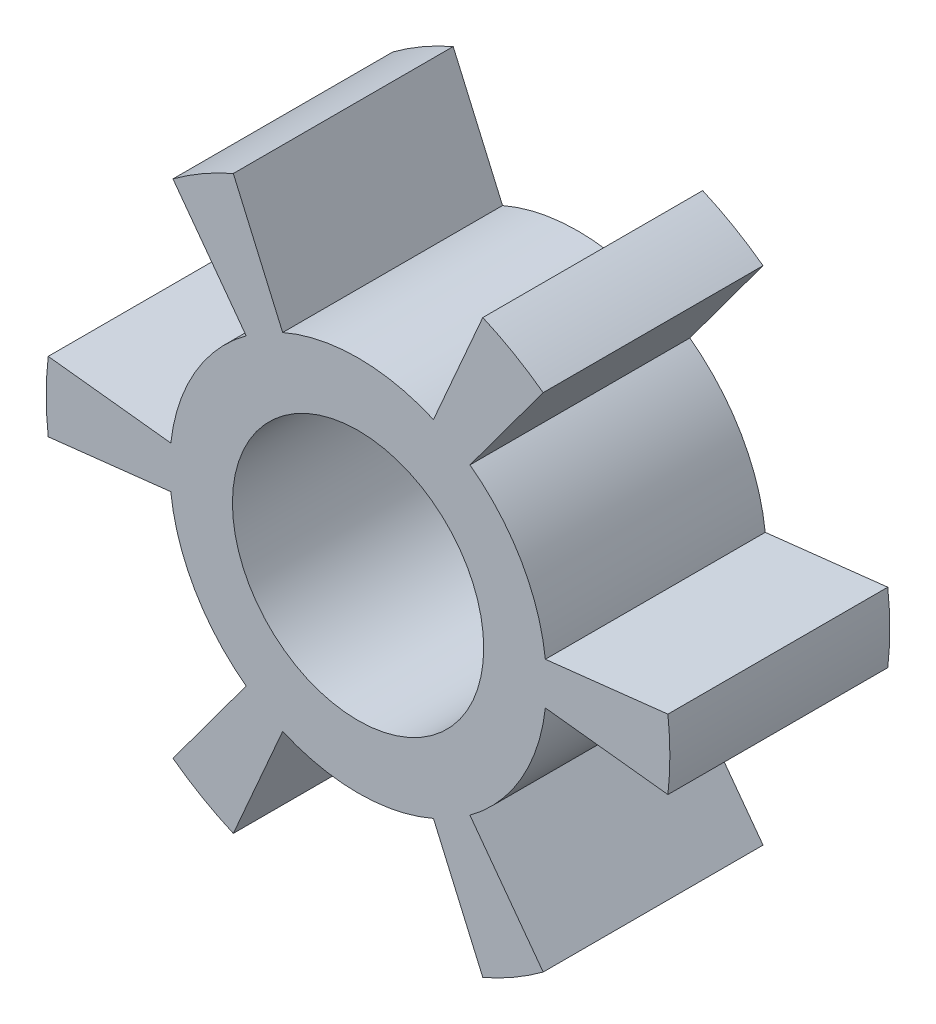
ISO-10303-21;
HEADER;
FILE_DESCRIPTION(('STEP AP214'),'2;1');
FILE_NAME('part.step','',(''),(''),'','','');
FILE_SCHEMA(('AUTOMOTIVE_DESIGN { 1 0 10303 214 1 1 1 1 }'));
ENDSEC;
DATA;
#1=APPLICATION_CONTEXT('core data for automotive mechanical design processes');
#2=APPLICATION_PROTOCOL_DEFINITION('international standard','automotive_design',2000,#1);
#3=PRODUCT_CONTEXT('',#1,'mechanical');
#4=PRODUCT('Part','Part','',(#3));
#5=PRODUCT_RELATED_PRODUCT_CATEGORY('part','',(#4));
#6=PRODUCT_DEFINITION_FORMATION('','',#4);
#7=PRODUCT_DEFINITION_CONTEXT('part definition',#1,'design');
#8=PRODUCT_DEFINITION('design','',#6,#7);
#9=PRODUCT_DEFINITION_SHAPE('','',#8);
#10=(LENGTH_UNIT() NAMED_UNIT(*) SI_UNIT(.MILLI.,.METRE.));
#11=(NAMED_UNIT(*) PLANE_ANGLE_UNIT() SI_UNIT($,.RADIAN.));
#12=(NAMED_UNIT(*) SI_UNIT($,.STERADIAN.) SOLID_ANGLE_UNIT());
#13=UNCERTAINTY_MEASURE_WITH_UNIT(LENGTH_MEASURE(1.E-05),#10,'distance_accuracy_value','');
#14=(GEOMETRIC_REPRESENTATION_CONTEXT(3) GLOBAL_UNCERTAINTY_ASSIGNED_CONTEXT((#13)) GLOBAL_UNIT_ASSIGNED_CONTEXT((#10,
#11,#12)) REPRESENTATION_CONTEXT('',''));
#15=CARTESIAN_POINT('',(0.,0.,0.));
#16=DIRECTION('',(0.,0.,1.));
#17=DIRECTION('',(1.,0.,0.));
#18=AXIS2_PLACEMENT_3D('',#15,#16,#17);
#19=CARTESIAN_POINT('',(0.,0.,0.));
#20=DIRECTION('',(0.,0.,-1.));
#21=DIRECTION('',(1.,0.,0.));
#22=AXIS2_PLACEMENT_3D('',#19,#20,#21);
#23=CYLINDRICAL_SURFACE('',#22,14.89);
#24=DIRECTION('',(0.,0.,-1.));
#25=VECTOR('',#24,1.);
#26=CARTESIAN_POINT('',(8.83957667783481,11.9822361918249,0.));
#27=LINE('',#26,#25);
#28=CARTESIAN_POINT('',(8.83957667783481,11.9822361918249,10.5));
#29=VERTEX_POINT('',#28);
#30=CARTESIAN_POINT('',(8.83957667783481,11.9822361918249,0.));
#31=VERTEX_POINT('',#30);
#32=EDGE_CURVE('E242',#29,#31,#27,.T.);
#33=ORIENTED_EDGE('',*,*,#32,.T.);
#34=CARTESIAN_POINT('',(0.,0.,0.));
#35=DIRECTION('',(0.,0.,1.));
#36=DIRECTION('',(1.,0.,0.));
#37=AXIS2_PLACEMENT_3D('',#34,#35,#36);
#38=CIRCLE('',#37,14.89);
#39=CARTESIAN_POINT('',(5.95713259734829,13.6464160576179,0.));
#40=VERTEX_POINT('',#39);
#41=EDGE_CURVE('E97',#31,#40,#38,.T.);
#42=ORIENTED_EDGE('',*,*,#41,.T.);
#43=DIRECTION('',(0.,0.,1.));
#44=VECTOR('',#43,1.);
#45=CARTESIAN_POINT('',(5.95713259734829,13.6464160576179,0.));
#46=LINE('',#45,#44);
#47=CARTESIAN_POINT('',(5.95713259734829,13.6464160576179,10.5));
#48=VERTEX_POINT('',#47);
#49=EDGE_CURVE('E234',#40,#48,#46,.T.);
#50=ORIENTED_EDGE('',*,*,#49,.T.);
#51=CARTESIAN_POINT('',(0.,0.,10.5));
#52=DIRECTION('',(0.,0.,1.));
#53=DIRECTION('',(1.,0.,0.));
#54=AXIS2_PLACEMENT_3D('',#51,#52,#53);
#55=CIRCLE('',#54,14.89);
#56=EDGE_CURVE('E26',#29,#48,#55,.T.);
#57=ORIENTED_EDGE('',*,*,#56,.F.);
#58=EDGE_LOOP('',(#33,#42,#50,#57));
#59=FACE_BOUND('',#58,.T.);
#60=ADVANCED_FACE('F15',(#59),#23,.T.);
#61=CARTESIAN_POINT('',(0.,0.,0.));
#62=DIRECTION('',(0.,0.,-1.));
#63=DIRECTION('',(-1.,0.,0.));
#64=AXIS2_PLACEMENT_3D('',#61,#62,#63);
#65=CYLINDRICAL_SURFACE('',#64,6.);
#66=CARTESIAN_POINT('',(0.,0.,0.));
#67=DIRECTION('',(0.,0.,-1.));
#68=DIRECTION('',(-1.,0.,0.));
#69=AXIS2_PLACEMENT_3D('',#66,#67,#68);
#70=CIRCLE('',#69,6.);
#71=CARTESIAN_POINT('',(6.,0.,0.));
#72=VERTEX_POINT('',#71);
#73=EDGE_CURVE('E290',#72,#72,#70,.T.);
#74=ORIENTED_EDGE('',*,*,#73,.T.);
#75=EDGE_LOOP('',(#74));
#76=FACE_BOUND('',#75,.T.);
#77=CARTESIAN_POINT('',(0.,0.,10.5));
#78=DIRECTION('',(0.,0.,-1.));
#79=DIRECTION('',(-1.,0.,0.));
#80=AXIS2_PLACEMENT_3D('',#77,#78,#79);
#81=CIRCLE('',#80,6.);
#82=CARTESIAN_POINT('',(6.,0.,10.5));
#83=VERTEX_POINT('',#82);
#84=EDGE_CURVE('E10',#83,#83,#81,.T.);
#85=ORIENTED_EDGE('',*,*,#84,.F.);
#86=EDGE_LOOP('',(#85));
#87=FACE_BOUND('',#86,.T.);
#88=ADVANCED_FACE('F483',(#76,#87),#65,.F.);
#89=CARTESIAN_POINT('',(0.,0.,10.5));
#90=DIRECTION('',(0.,0.,1.));
#91=DIRECTION('',(1.,0.,0.));
#92=AXIS2_PLACEMENT_3D('',#89,#90,#91);
#93=PLANE('',#92);
#94=ORIENTED_EDGE('',*,*,#84,.T.);
#95=EDGE_LOOP('',(#94));
#96=FACE_BOUND('',#95,.T.);
#97=DIRECTION('',(0.593658608316643,0.80471700415211,0.));
#98=VECTOR('',#97,1.);
#99=CARTESIAN_POINT('',(4.41978833891741,5.99111809591246,10.5));
#100=LINE('',#99,#98);
#101=CARTESIAN_POINT('',(5.34292747484979,7.24245303736899,10.5));
#102=VERTEX_POINT('',#101);
#103=EDGE_CURVE('E317',#102,#29,#100,.T.);
#104=ORIENTED_EDGE('',*,*,#103,.T.);
#105=ORIENTED_EDGE('',*,*,#56,.T.);
#106=DIRECTION('',(-0.400076064294714,-0.916481938053583,0.));
#107=VECTOR('',#106,1.);
#108=CARTESIAN_POINT('',(1.80034228932622,4.12416872124112,10.5));
#109=LINE('',#108,#107);
#110=CARTESIAN_POINT('',(3.60068457865243,8.24833744248225,10.5));
#111=VERTEX_POINT('',#110);
#112=EDGE_CURVE('E237',#48,#111,#109,.T.);
#113=ORIENTED_EDGE('',*,*,#112,.T.);
#114=CARTESIAN_POINT('',(0.,0.,10.5));
#115=DIRECTION('',(0.,0.,1.));
#116=DIRECTION('',(-1.,0.,0.));
#117=AXIS2_PLACEMENT_3D('',#114,#115,#116);
#118=CIRCLE('',#117,9.);
#119=CARTESIAN_POINT('',(-3.60068457865243,8.24833744248225,10.5));
#120=VERTEX_POINT('',#119);
#121=EDGE_CURVE('E358',#111,#120,#118,.T.);
#122=ORIENTED_EDGE('',*,*,#121,.T.);
#123=DIRECTION('',(-0.400076064294714,0.916481938053583,0.));
#124=VECTOR('',#123,1.);
#125=CARTESIAN_POINT('',(-2.97856629867415,6.82320802880893,10.5));
#126=LINE('',#125,#124);
#127=CARTESIAN_POINT('',(-5.95713259734829,13.6464160576178,10.5));
#128=VERTEX_POINT('',#127);
#129=EDGE_CURVE('E308',#120,#128,#126,.T.);
#130=ORIENTED_EDGE('',*,*,#129,.T.);
#131=CARTESIAN_POINT('',(0.,0.,10.5));
#132=DIRECTION('',(0.,0.,1.));
#133=DIRECTION('',(1.,0.,0.));
#134=AXIS2_PLACEMENT_3D('',#131,#132,#133);
#135=CIRCLE('',#134,14.89);
#136=CARTESIAN_POINT('',(-8.8395766778348,11.9822361918249,10.5));
#137=VERTEX_POINT('',#136);
#138=EDGE_CURVE('E315',#128,#137,#135,.T.);
#139=ORIENTED_EDGE('',*,*,#138,.T.);
#140=DIRECTION('',(0.593658608316642,-0.80471700415211,0.));
#141=VECTOR('',#140,1.);
#142=CARTESIAN_POINT('',(-2.67146373742489,3.6212265186845,10.5));
#143=LINE('',#142,#141);
#144=CARTESIAN_POINT('',(-5.34292747484978,7.242453037369,10.5));
#145=VERTEX_POINT('',#144);
#146=EDGE_CURVE('E286',#137,#145,#143,.T.);
#147=ORIENTED_EDGE('',*,*,#146,.T.);
#148=CARTESIAN_POINT('',(0.,0.,10.5));
#149=DIRECTION('',(0.,0.,1.));
#150=DIRECTION('',(-0.5,-0.866025403784439,0.));
#151=AXIS2_PLACEMENT_3D('',#148,#149,#150);
#152=CIRCLE('',#151,9.);
#153=CARTESIAN_POINT('',(-8.94361205350221,1.00588440511326,10.5));
#154=VERTEX_POINT('',#153);
#155=EDGE_CURVE('E280',#145,#154,#152,.T.);
#156=ORIENTED_EDGE('',*,*,#155,.T.);
#157=DIRECTION('',(-0.993734672611356,0.111764933901473,0.));
#158=VECTOR('',#157,1.);
#159=CARTESIAN_POINT('',(-7.39835463759155,0.832089932896466,10.5));
#160=LINE('',#159,#158);
#161=CARTESIAN_POINT('',(-14.7967092751831,1.66417986579293,10.5));
#162=VERTEX_POINT('',#161);
#163=EDGE_CURVE('E206',#154,#162,#160,.T.);
#164=ORIENTED_EDGE('',*,*,#163,.T.);
#165=CARTESIAN_POINT('',(0.,0.,10.5));
#166=DIRECTION('',(0.,0.,1.));
#167=DIRECTION('',(1.,0.,0.));
#168=AXIS2_PLACEMENT_3D('',#165,#166,#167);
#169=CIRCLE('',#168,14.89);
#170=CARTESIAN_POINT('',(-14.7967092751831,-1.66417986579293,10.5));
#171=VERTEX_POINT('',#170);
#172=EDGE_CURVE('E198',#162,#171,#169,.T.);
#173=ORIENTED_EDGE('',*,*,#172,.T.);
#174=DIRECTION('',(0.993734672611356,0.111764933901472,0.));
#175=VECTOR('',#174,1.);
#176=CARTESIAN_POINT('',(-4.47180602675111,-0.502942202556627,10.5));
#177=LINE('',#176,#175);
#178=CARTESIAN_POINT('',(-8.94361205350221,-1.00588440511325,10.5));
#179=VERTEX_POINT('',#178);
#180=EDGE_CURVE('E203',#171,#179,#177,.T.);
#181=ORIENTED_EDGE('',*,*,#180,.T.);
#182=CARTESIAN_POINT('',(0.,0.,10.5));
#183=DIRECTION('',(0.,0.,1.));
#184=DIRECTION('',(0.5,-0.866025403784439,0.));
#185=AXIS2_PLACEMENT_3D('',#182,#183,#184);
#186=CIRCLE('',#185,9.);
#187=CARTESIAN_POINT('',(-5.34292747484978,-7.24245303736899,10.5));
#188=VERTEX_POINT('',#187);
#189=EDGE_CURVE('E240',#179,#188,#186,.T.);
#190=ORIENTED_EDGE('',*,*,#189,.T.);
#191=DIRECTION('',(-0.593658608316642,-0.80471700415211,0.));
#192=VECTOR('',#191,1.);
#193=CARTESIAN_POINT('',(-4.4197883389174,-5.99111809591246,10.5));
#194=LINE('',#193,#192);
#195=CARTESIAN_POINT('',(-8.8395766778348,-11.9822361918249,10.5));
#196=VERTEX_POINT('',#195);
#197=EDGE_CURVE('E343',#188,#196,#194,.T.);
#198=ORIENTED_EDGE('',*,*,#197,.T.);
#199=CARTESIAN_POINT('',(0.,0.,10.5));
#200=DIRECTION('',(0.,0.,1.));
#201=DIRECTION('',(1.,0.,0.));
#202=AXIS2_PLACEMENT_3D('',#199,#200,#201);
#203=CIRCLE('',#202,14.89);
#204=CARTESIAN_POINT('',(-5.95713259734829,-13.6464160576178,10.5));
#205=VERTEX_POINT('',#204);
#206=EDGE_CURVE('E211',#196,#205,#203,.T.);
#207=ORIENTED_EDGE('',*,*,#206,.T.);
#208=DIRECTION('',(0.400076064294714,0.916481938053583,0.));
#209=VECTOR('',#208,1.);
#210=CARTESIAN_POINT('',(-1.80034228932622,-4.12416872124112,10.5));
#211=LINE('',#210,#209);
#212=CARTESIAN_POINT('',(-3.60068457865243,-8.24833744248225,10.5));
#213=VERTEX_POINT('',#212);
#214=EDGE_CURVE('E257',#205,#213,#211,.T.);
#215=ORIENTED_EDGE('',*,*,#214,.T.);
#216=CARTESIAN_POINT('',(0.,0.,10.5));
#217=DIRECTION('',(0.,0.,1.));
#218=DIRECTION('',(1.,0.,0.));
#219=AXIS2_PLACEMENT_3D('',#216,#217,#218);
#220=CIRCLE('',#219,9.);
#221=CARTESIAN_POINT('',(3.60068457865243,-8.24833744248225,10.5));
#222=VERTEX_POINT('',#221);
#223=EDGE_CURVE('E322',#213,#222,#220,.T.);
#224=ORIENTED_EDGE('',*,*,#223,.T.);
#225=DIRECTION('',(0.400076064294714,-0.916481938053583,0.));
#226=VECTOR('',#225,1.);
#227=CARTESIAN_POINT('',(2.97856629867415,-6.82320802880893,10.5));
#228=LINE('',#227,#226);
#229=CARTESIAN_POINT('',(5.95713259734829,-13.6464160576178,10.5));
#230=VERTEX_POINT('',#229);
#231=EDGE_CURVE('E333',#222,#230,#228,.T.);
#232=ORIENTED_EDGE('',*,*,#231,.T.);
#233=CARTESIAN_POINT('',(0.,0.,10.5));
#234=DIRECTION('',(0.,0.,1.));
#235=DIRECTION('',(1.,0.,0.));
#236=AXIS2_PLACEMENT_3D('',#233,#234,#235);
#237=CIRCLE('',#236,14.89);
#238=CARTESIAN_POINT('',(8.8395766778348,-11.9822361918249,10.5));
#239=VERTEX_POINT('',#238);
#240=EDGE_CURVE('E350',#230,#239,#237,.T.);
#241=ORIENTED_EDGE('',*,*,#240,.T.);
#242=DIRECTION('',(-0.593658608316642,0.804717004152111,0.));
#243=VECTOR('',#242,1.);
#244=CARTESIAN_POINT('',(2.67146373742489,-3.6212265186845,10.5));
#245=LINE('',#244,#243);
#246=CARTESIAN_POINT('',(5.34292747484978,-7.242453037369,10.5));
#247=VERTEX_POINT('',#246);
#248=EDGE_CURVE('E232',#239,#247,#245,.T.);
#249=ORIENTED_EDGE('',*,*,#248,.T.);
#250=CARTESIAN_POINT('',(0.,0.,10.5));
#251=DIRECTION('',(0.,0.,1.));
#252=DIRECTION('',(0.5,0.866025403784439,0.));
#253=AXIS2_PLACEMENT_3D('',#250,#251,#252);
#254=CIRCLE('',#253,9.);
#255=CARTESIAN_POINT('',(8.94361205350221,-1.00588440511326,10.5));
#256=VERTEX_POINT('',#255);
#257=EDGE_CURVE('E269',#247,#256,#254,.T.);
#258=ORIENTED_EDGE('',*,*,#257,.T.);
#259=DIRECTION('',(0.993734672611356,-0.111764933901473,0.));
#260=VECTOR('',#259,1.);
#261=CARTESIAN_POINT('',(7.39835463759155,-0.832089932896468,10.5));
#262=LINE('',#261,#260);
#263=CARTESIAN_POINT('',(14.7967092751831,-1.66417986579293,10.5));
#264=VERTEX_POINT('',#263);
#265=EDGE_CURVE('E273',#256,#264,#262,.T.);
#266=ORIENTED_EDGE('',*,*,#265,.T.);
#267=CARTESIAN_POINT('',(0.,0.,10.5));
#268=DIRECTION('',(0.,0.,1.));
#269=DIRECTION('',(1.,0.,0.));
#270=AXIS2_PLACEMENT_3D('',#267,#268,#269);
#271=CIRCLE('',#270,14.89);
#272=CARTESIAN_POINT('',(14.7967092751831,1.66417986579292,10.5));
#273=VERTEX_POINT('',#272);
#274=EDGE_CURVE('E177',#264,#273,#271,.T.);
#275=ORIENTED_EDGE('',*,*,#274,.T.);
#276=DIRECTION('',(-0.993734672611356,-0.111764933901472,0.));
#277=VECTOR('',#276,1.);
#278=CARTESIAN_POINT('',(4.47180602675111,0.502942202556624,10.5));
#279=LINE('',#278,#277);
#280=CARTESIAN_POINT('',(8.94361205350221,1.00588440511325,10.5));
#281=VERTEX_POINT('',#280);
#282=EDGE_CURVE('E245',#273,#281,#279,.T.);
#283=ORIENTED_EDGE('',*,*,#282,.T.);
#284=CARTESIAN_POINT('',(0.,0.,10.5));
#285=DIRECTION('',(0.,0.,1.));
#286=DIRECTION('',(-0.5,0.866025403784439,0.));
#287=AXIS2_PLACEMENT_3D('',#284,#285,#286);
#288=CIRCLE('',#287,9.);
#289=EDGE_CURVE('E243',#281,#102,#288,.T.);
#290=ORIENTED_EDGE('',*,*,#289,.T.);
#291=EDGE_LOOP('',(#104,#105,#113,#122,#130,#139,#147,#156,#164,#173,#181,#190,#198,#207,#215,
#224,#232,#241,#249,#258,#266,#275,#283,#290));
#292=FACE_BOUND('',#291,.T.);
#293=ADVANCED_FACE('F200',(#96,#292),#93,.T.);
#294=CARTESIAN_POINT('',(-5.95713259734829,13.6464160576178,0.));
#295=DIRECTION('',(-0.916481938053583,-0.400076064294714,0.));
#296=DIRECTION('',(0.400076064294714,-0.916481938053583,0.));
#297=AXIS2_PLACEMENT_3D('',#294,#295,#296);
#298=PLANE('',#297);
#299=DIRECTION('',(0.400076064294714,-0.916481938053583,0.));
#300=VECTOR('',#299,1.);
#301=CARTESIAN_POINT('',(-2.97856629867415,6.82320802880893,0.));
#302=LINE('',#301,#300);
#303=CARTESIAN_POINT('',(-5.95713259734829,13.6464160576178,0.));
#304=VERTEX_POINT('',#303);
#305=CARTESIAN_POINT('',(-3.60068457865243,8.24833744248225,0.));
#306=VERTEX_POINT('',#305);
#307=EDGE_CURVE('E19',#304,#306,#302,.T.);
#308=ORIENTED_EDGE('',*,*,#307,.F.);
#309=DIRECTION('',(0.,0.,-1.));
#310=VECTOR('',#309,1.);
#311=CARTESIAN_POINT('',(-5.95713259734829,13.6464160576179,0.));
#312=LINE('',#311,#310);
#313=EDGE_CURVE('E212',#128,#304,#312,.T.);
#314=ORIENTED_EDGE('',*,*,#313,.F.);
#315=ORIENTED_EDGE('',*,*,#129,.F.);
#316=DIRECTION('',(0.,0.,1.));
#317=VECTOR('',#316,1.);
#318=CARTESIAN_POINT('',(-3.60068457865243,8.24833744248225,0.));
#319=LINE('',#318,#317);
#320=EDGE_CURVE('E236',#306,#120,#319,.T.);
#321=ORIENTED_EDGE('',*,*,#320,.F.);
#322=EDGE_LOOP('',(#308,#314,#315,#321));
#323=FACE_BOUND('',#322,.T.);
#324=ADVANCED_FACE('F492',(#323),#298,.F.);
#325=CARTESIAN_POINT('',(0.,0.,0.));
#326=DIRECTION('',(0.,0.,-1.));
#327=DIRECTION('',(-1.,0.,0.));
#328=AXIS2_PLACEMENT_3D('',#325,#326,#327);
#329=CYLINDRICAL_SURFACE('',#328,9.);
#330=CARTESIAN_POINT('',(0.,0.,0.));
#331=DIRECTION('',(0.,0.,-1.));
#332=DIRECTION('',(-1.,0.,0.));
#333=AXIS2_PLACEMENT_3D('',#330,#331,#332);
#334=CIRCLE('',#333,9.);
#335=CARTESIAN_POINT('',(3.60068457865243,8.24833744248225,0.));
#336=VERTEX_POINT('',#335);
#337=EDGE_CURVE('E264',#306,#336,#334,.T.);
#338=ORIENTED_EDGE('',*,*,#337,.F.);
#339=ORIENTED_EDGE('',*,*,#320,.T.);
#340=ORIENTED_EDGE('',*,*,#121,.F.);
#341=DIRECTION('',(0.,0.,1.));
#342=VECTOR('',#341,1.);
#343=CARTESIAN_POINT('',(3.60068457865243,8.24833744248225,0.));
#344=LINE('',#343,#342);
#345=EDGE_CURVE('E296',#336,#111,#344,.T.);
#346=ORIENTED_EDGE('',*,*,#345,.F.);
#347=EDGE_LOOP('',(#338,#339,#340,#346));
#348=FACE_BOUND('',#347,.T.);
#349=ADVANCED_FACE('F511',(#348),#329,.T.);
#350=CARTESIAN_POINT('',(3.60068457865243,8.24833744248225,0.));
#351=DIRECTION('',(0.916481938053583,-0.400076064294714,0.));
#352=DIRECTION('',(0.400076064294714,0.916481938053583,0.));
#353=AXIS2_PLACEMENT_3D('',#350,#351,#352);
#354=PLANE('',#353);
#355=DIRECTION('',(0.400076064294714,0.916481938053583,0.));
#356=VECTOR('',#355,1.);
#357=CARTESIAN_POINT('',(1.80034228932622,4.12416872124112,0.));
#358=LINE('',#357,#356);
#359=EDGE_CURVE('E262',#336,#40,#358,.T.);
#360=ORIENTED_EDGE('',*,*,#359,.F.);
#361=ORIENTED_EDGE('',*,*,#345,.T.);
#362=ORIENTED_EDGE('',*,*,#112,.F.);
#363=ORIENTED_EDGE('',*,*,#49,.F.);
#364=EDGE_LOOP('',(#360,#361,#362,#363));
#365=FACE_BOUND('',#364,.T.);
#366=ADVANCED_FACE('F478',(#365),#354,.F.);
#367=CARTESIAN_POINT('',(0.,0.,0.));
#368=DIRECTION('',(0.,0.,-1.));
#369=DIRECTION('',(1.,0.,0.));
#370=AXIS2_PLACEMENT_3D('',#367,#368,#369);
#371=CYLINDRICAL_SURFACE('',#370,14.89);
#372=DIRECTION('',(0.,0.,1.));
#373=VECTOR('',#372,1.);
#374=CARTESIAN_POINT('',(14.7967092751831,1.66417986579292,0.));
#375=LINE('',#374,#373);
#376=CARTESIAN_POINT('',(14.7967092751831,1.66417986579292,0.));
#377=VERTEX_POINT('',#376);
#378=EDGE_CURVE('E248',#377,#273,#375,.T.);
#379=ORIENTED_EDGE('',*,*,#378,.T.);
#380=ORIENTED_EDGE('',*,*,#274,.F.);
#381=DIRECTION('',(0.,0.,-1.));
#382=VECTOR('',#381,1.);
#383=CARTESIAN_POINT('',(14.7967092751831,-1.66417986579293,0.));
#384=LINE('',#383,#382);
#385=CARTESIAN_POINT('',(14.7967092751831,-1.66417986579293,0.));
#386=VERTEX_POINT('',#385);
#387=EDGE_CURVE('E328',#264,#386,#384,.T.);
#388=ORIENTED_EDGE('',*,*,#387,.T.);
#389=CARTESIAN_POINT('',(0.,0.,0.));
#390=DIRECTION('',(0.,0.,1.));
#391=DIRECTION('',(1.,0.,0.));
#392=AXIS2_PLACEMENT_3D('',#389,#390,#391);
#393=CIRCLE('',#392,14.89);
#394=EDGE_CURVE('E371',#386,#377,#393,.T.);
#395=ORIENTED_EDGE('',*,*,#394,.T.);
#396=EDGE_LOOP('',(#379,#380,#388,#395));
#397=FACE_BOUND('',#396,.T.);
#398=ADVANCED_FACE('F440',(#397),#371,.T.);
#399=CARTESIAN_POINT('',(0.,0.,0.));
#400=DIRECTION('',(0.,0.,-1.));
#401=DIRECTION('',(1.,0.,0.));
#402=AXIS2_PLACEMENT_3D('',#399,#400,#401);
#403=CYLINDRICAL_SURFACE('',#402,14.89);
#404=DIRECTION('',(0.,0.,1.));
#405=VECTOR('',#404,1.);
#406=CARTESIAN_POINT('',(8.8395766778348,-11.9822361918249,0.));
#407=LINE('',#406,#405);
#408=CARTESIAN_POINT('',(8.8395766778348,-11.9822361918249,0.));
#409=VERTEX_POINT('',#408);
#410=EDGE_CURVE('E332',#409,#239,#407,.T.);
#411=ORIENTED_EDGE('',*,*,#410,.T.);
#412=ORIENTED_EDGE('',*,*,#240,.F.);
#413=DIRECTION('',(0.,0.,-1.));
#414=VECTOR('',#413,1.);
#415=CARTESIAN_POINT('',(5.95713259734829,-13.6464160576179,0.));
#416=LINE('',#415,#414);
#417=CARTESIAN_POINT('',(5.95713259734829,-13.6464160576178,0.));
#418=VERTEX_POINT('',#417);
#419=EDGE_CURVE('E336',#230,#418,#416,.T.);
#420=ORIENTED_EDGE('',*,*,#419,.T.);
#421=CARTESIAN_POINT('',(0.,0.,0.));
#422=DIRECTION('',(0.,0.,1.));
#423=DIRECTION('',(1.,0.,0.));
#424=AXIS2_PLACEMENT_3D('',#421,#422,#423);
#425=CIRCLE('',#424,14.89);
#426=EDGE_CURVE('E312',#418,#409,#425,.T.);
#427=ORIENTED_EDGE('',*,*,#426,.T.);
#428=EDGE_LOOP('',(#411,#412,#420,#427));
#429=FACE_BOUND('',#428,.T.);
#430=ADVANCED_FACE('F470',(#429),#403,.T.);
#431=CARTESIAN_POINT('',(0.,0.,0.));
#432=DIRECTION('',(0.,0.,-1.));
#433=DIRECTION('',(1.,0.,0.));
#434=AXIS2_PLACEMENT_3D('',#431,#432,#433);
#435=CYLINDRICAL_SURFACE('',#434,14.89);
#436=DIRECTION('',(0.,0.,1.));
#437=VECTOR('',#436,1.);
#438=CARTESIAN_POINT('',(-5.95713259734829,-13.6464160576179,0.));
#439=LINE('',#438,#437);
#440=CARTESIAN_POINT('',(-5.95713259734829,-13.6464160576178,0.));
#441=VERTEX_POINT('',#440);
#442=EDGE_CURVE('E260',#441,#205,#439,.T.);
#443=ORIENTED_EDGE('',*,*,#442,.T.);
#444=ORIENTED_EDGE('',*,*,#206,.F.);
#445=DIRECTION('',(0.,0.,-1.));
#446=VECTOR('',#445,1.);
#447=CARTESIAN_POINT('',(-8.8395766778348,-11.9822361918249,0.));
#448=LINE('',#447,#446);
#449=CARTESIAN_POINT('',(-8.8395766778348,-11.9822361918249,0.));
#450=VERTEX_POINT('',#449);
#451=EDGE_CURVE('E239',#196,#450,#448,.T.);
#452=ORIENTED_EDGE('',*,*,#451,.T.);
#453=CARTESIAN_POINT('',(0.,0.,0.));
#454=DIRECTION('',(0.,0.,1.));
#455=DIRECTION('',(1.,0.,0.));
#456=AXIS2_PLACEMENT_3D('',#453,#454,#455);
#457=CIRCLE('',#456,14.89);
#458=EDGE_CURVE('E256',#450,#441,#457,.T.);
#459=ORIENTED_EDGE('',*,*,#458,.T.);
#460=EDGE_LOOP('',(#443,#444,#452,#459));
#461=FACE_BOUND('',#460,.T.);
#462=ADVANCED_FACE('F414',(#461),#435,.T.);
#463=CARTESIAN_POINT('',(0.,0.,0.));
#464=DIRECTION('',(0.,0.,-1.));
#465=DIRECTION('',(1.,0.,0.));
#466=AXIS2_PLACEMENT_3D('',#463,#464,#465);
#467=CYLINDRICAL_SURFACE('',#466,14.89);
#468=DIRECTION('',(0.,0.,1.));
#469=VECTOR('',#468,1.);
#470=CARTESIAN_POINT('',(-14.7967092751831,-1.66417986579292,0.));
#471=LINE('',#470,#469);
#472=CARTESIAN_POINT('',(-14.7967092751831,-1.66417986579293,0.));
#473=VERTEX_POINT('',#472);
#474=EDGE_CURVE('E215',#473,#171,#471,.T.);
#475=ORIENTED_EDGE('',*,*,#474,.T.);
#476=ORIENTED_EDGE('',*,*,#172,.F.);
#477=DIRECTION('',(0.,0.,-1.));
#478=VECTOR('',#477,1.);
#479=CARTESIAN_POINT('',(-14.7967092751831,1.66417986579293,0.));
#480=LINE('',#479,#478);
#481=CARTESIAN_POINT('',(-14.7967092751831,1.66417986579293,0.));
#482=VERTEX_POINT('',#481);
#483=EDGE_CURVE('E250',#162,#482,#480,.T.);
#484=ORIENTED_EDGE('',*,*,#483,.T.);
#485=CARTESIAN_POINT('',(0.,0.,0.));
#486=DIRECTION('',(0.,0.,1.));
#487=DIRECTION('',(1.,0.,0.));
#488=AXIS2_PLACEMENT_3D('',#485,#486,#487);
#489=CIRCLE('',#488,14.89);
#490=EDGE_CURVE('E217',#482,#473,#489,.T.);
#491=ORIENTED_EDGE('',*,*,#490,.T.);
#492=EDGE_LOOP('',(#475,#476,#484,#491));
#493=FACE_BOUND('',#492,.T.);
#494=ADVANCED_FACE('F216',(#493),#467,.T.);
#495=CARTESIAN_POINT('',(0.,0.,0.));
#496=DIRECTION('',(0.,0.,-1.));
#497=DIRECTION('',(1.,0.,0.));
#498=AXIS2_PLACEMENT_3D('',#495,#496,#497);
#499=CYLINDRICAL_SURFACE('',#498,14.89);
#500=DIRECTION('',(0.,0.,1.));
#501=VECTOR('',#500,1.);
#502=CARTESIAN_POINT('',(-8.8395766778348,11.9822361918249,0.));
#503=LINE('',#502,#501);
#504=CARTESIAN_POINT('',(-8.8395766778348,11.9822361918249,0.));
#505=VERTEX_POINT('',#504);
#506=EDGE_CURVE('E344',#505,#137,#503,.T.);
#507=ORIENTED_EDGE('',*,*,#506,.T.);
#508=ORIENTED_EDGE('',*,*,#138,.F.);
#509=ORIENTED_EDGE('',*,*,#313,.T.);
#510=CARTESIAN_POINT('',(0.,0.,0.));
#511=DIRECTION('',(0.,0.,1.));
#512=DIRECTION('',(1.,0.,0.));
#513=AXIS2_PLACEMENT_3D('',#510,#511,#512);
#514=CIRCLE('',#513,14.89);
#515=EDGE_CURVE('E255',#304,#505,#514,.T.);
#516=ORIENTED_EDGE('',*,*,#515,.T.);
#517=EDGE_LOOP('',(#507,#508,#509,#516));
#518=FACE_BOUND('',#517,.T.);
#519=ADVANCED_FACE('F17',(#518),#499,.T.);
#520=CARTESIAN_POINT('',(0.,0.,0.));
#521=DIRECTION('',(0.,0.,1.));
#522=DIRECTION('',(1.,0.,0.));
#523=AXIS2_PLACEMENT_3D('',#520,#521,#522);
#524=PLANE('',#523);
#525=DIRECTION('',(-0.593658608316643,-0.80471700415211,0.));
#526=VECTOR('',#525,1.);
#527=CARTESIAN_POINT('',(4.41978833891741,5.99111809591246,0.));
#528=LINE('',#527,#526);
#529=CARTESIAN_POINT('',(5.34292747484979,7.24245303736899,0.));
#530=VERTEX_POINT('',#529);
#531=EDGE_CURVE('E241',#31,#530,#528,.T.);
#532=ORIENTED_EDGE('',*,*,#531,.T.);
#533=CARTESIAN_POINT('',(0.,0.,0.));
#534=DIRECTION('',(0.,0.,-1.));
#535=DIRECTION('',(-0.5,0.866025403784439,0.));
#536=AXIS2_PLACEMENT_3D('',#533,#534,#535);
#537=CIRCLE('',#536,9.);
#538=CARTESIAN_POINT('',(8.94361205350221,1.00588440511325,0.));
#539=VERTEX_POINT('',#538);
#540=EDGE_CURVE('E295',#530,#539,#537,.T.);
#541=ORIENTED_EDGE('',*,*,#540,.T.);
#542=DIRECTION('',(0.993734672611356,0.111764933901472,0.));
#543=VECTOR('',#542,1.);
#544=CARTESIAN_POINT('',(4.47180602675111,0.502942202556624,0.));
#545=LINE('',#544,#543);
#546=EDGE_CURVE('E303',#539,#377,#545,.T.);
#547=ORIENTED_EDGE('',*,*,#546,.T.);
#548=ORIENTED_EDGE('',*,*,#394,.F.);
#549=DIRECTION('',(-0.993734672611356,0.111764933901473,0.));
#550=VECTOR('',#549,1.);
#551=CARTESIAN_POINT('',(7.39835463759155,-0.832089932896468,0.));
#552=LINE('',#551,#550);
#553=CARTESIAN_POINT('',(8.94361205350221,-1.00588440511326,0.));
#554=VERTEX_POINT('',#553);
#555=EDGE_CURVE('E326',#386,#554,#552,.T.);
#556=ORIENTED_EDGE('',*,*,#555,.T.);
#557=CARTESIAN_POINT('',(0.,0.,0.));
#558=DIRECTION('',(0.,0.,-1.));
#559=DIRECTION('',(0.5,0.866025403784439,0.));
#560=AXIS2_PLACEMENT_3D('',#557,#558,#559);
#561=CIRCLE('',#560,9.);
#562=CARTESIAN_POINT('',(5.34292747484978,-7.242453037369,0.));
#563=VERTEX_POINT('',#562);
#564=EDGE_CURVE('E270',#554,#563,#561,.T.);
#565=ORIENTED_EDGE('',*,*,#564,.T.);
#566=DIRECTION('',(0.593658608316642,-0.804717004152111,0.));
#567=VECTOR('',#566,1.);
#568=CARTESIAN_POINT('',(2.67146373742489,-3.6212265186845,0.));
#569=LINE('',#568,#567);
#570=EDGE_CURVE('E318',#563,#409,#569,.T.);
#571=ORIENTED_EDGE('',*,*,#570,.T.);
#572=ORIENTED_EDGE('',*,*,#426,.F.);
#573=DIRECTION('',(-0.400076064294714,0.916481938053583,0.));
#574=VECTOR('',#573,1.);
#575=CARTESIAN_POINT('',(2.97856629867415,-6.82320802880893,0.));
#576=LINE('',#575,#574);
#577=CARTESIAN_POINT('',(3.60068457865243,-8.24833744248225,0.));
#578=VERTEX_POINT('',#577);
#579=EDGE_CURVE('E325',#418,#578,#576,.T.);
#580=ORIENTED_EDGE('',*,*,#579,.T.);
#581=CARTESIAN_POINT('',(0.,0.,0.));
#582=DIRECTION('',(0.,0.,-1.));
#583=DIRECTION('',(1.,0.,0.));
#584=AXIS2_PLACEMENT_3D('',#581,#582,#583);
#585=CIRCLE('',#584,9.);
#586=CARTESIAN_POINT('',(-3.60068457865243,-8.24833744248225,0.));
#587=VERTEX_POINT('',#586);
#588=EDGE_CURVE('E182',#578,#587,#585,.T.);
#589=ORIENTED_EDGE('',*,*,#588,.T.);
#590=DIRECTION('',(-0.400076064294714,-0.916481938053583,0.));
#591=VECTOR('',#590,1.);
#592=CARTESIAN_POINT('',(-1.80034228932622,-4.12416872124112,0.));
#593=LINE('',#592,#591);
#594=EDGE_CURVE('E271',#587,#441,#593,.T.);
#595=ORIENTED_EDGE('',*,*,#594,.T.);
#596=ORIENTED_EDGE('',*,*,#458,.F.);
#597=DIRECTION('',(0.593658608316642,0.80471700415211,0.));
#598=VECTOR('',#597,1.);
#599=CARTESIAN_POINT('',(-4.4197883389174,-5.99111809591246,0.));
#600=LINE('',#599,#598);
#601=CARTESIAN_POINT('',(-5.34292747484978,-7.24245303736899,0.));
#602=VERTEX_POINT('',#601);
#603=EDGE_CURVE('E192',#450,#602,#600,.T.);
#604=ORIENTED_EDGE('',*,*,#603,.T.);
#605=CARTESIAN_POINT('',(0.,0.,0.));
#606=DIRECTION('',(0.,0.,-1.));
#607=DIRECTION('',(0.5,-0.866025403784439,0.));
#608=AXIS2_PLACEMENT_3D('',#605,#606,#607);
#609=CIRCLE('',#608,9.);
#610=CARTESIAN_POINT('',(-8.94361205350221,-1.00588440511325,0.));
#611=VERTEX_POINT('',#610);
#612=EDGE_CURVE('E221',#602,#611,#609,.T.);
#613=ORIENTED_EDGE('',*,*,#612,.T.);
#614=DIRECTION('',(-0.993734672611356,-0.111764933901472,0.));
#615=VECTOR('',#614,1.);
#616=CARTESIAN_POINT('',(-4.47180602675111,-0.502942202556627,0.));
#617=LINE('',#616,#615);
#618=EDGE_CURVE('E228',#611,#473,#617,.T.);
#619=ORIENTED_EDGE('',*,*,#618,.T.);
#620=ORIENTED_EDGE('',*,*,#490,.F.);
#621=DIRECTION('',(0.993734672611356,-0.111764933901473,0.));
#622=VECTOR('',#621,1.);
#623=CARTESIAN_POINT('',(-7.39835463759155,0.832089932896466,0.));
#624=LINE('',#623,#622);
#625=CARTESIAN_POINT('',(-8.94361205350221,1.00588440511326,0.));
#626=VERTEX_POINT('',#625);
#627=EDGE_CURVE('E252',#482,#626,#624,.T.);
#628=ORIENTED_EDGE('',*,*,#627,.T.);
#629=CARTESIAN_POINT('',(0.,0.,0.));
#630=DIRECTION('',(0.,0.,-1.));
#631=DIRECTION('',(-0.5,-0.866025403784439,0.));
#632=AXIS2_PLACEMENT_3D('',#629,#630,#631);
#633=CIRCLE('',#632,9.);
#634=CARTESIAN_POINT('',(-5.34292747484978,7.242453037369,0.));
#635=VERTEX_POINT('',#634);
#636=EDGE_CURVE('E281',#626,#635,#633,.T.);
#637=ORIENTED_EDGE('',*,*,#636,.T.);
#638=DIRECTION('',(-0.593658608316642,0.80471700415211,0.));
#639=VECTOR('',#638,1.);
#640=CARTESIAN_POINT('',(-2.67146373742489,3.6212265186845,0.));
#641=LINE('',#640,#639);
#642=EDGE_CURVE('E287',#635,#505,#641,.T.);
#643=ORIENTED_EDGE('',*,*,#642,.T.);
#644=ORIENTED_EDGE('',*,*,#515,.F.);
#645=ORIENTED_EDGE('',*,*,#307,.T.);
#646=ORIENTED_EDGE('',*,*,#337,.T.);
#647=ORIENTED_EDGE('',*,*,#359,.T.);
#648=ORIENTED_EDGE('',*,*,#41,.F.);
#649=EDGE_LOOP('',(#532,#541,#547,#548,#556,#565,#571,#572,#580,#589,#595,#596,#604,#613,#619,
#620,#628,#637,#643,#644,#645,#646,#647,#648));
#650=FACE_BOUND('',#649,.T.);
#651=ORIENTED_EDGE('',*,*,#73,.F.);
#652=EDGE_LOOP('',(#651));
#653=FACE_BOUND('',#652,.T.);
#654=ADVANCED_FACE('F410',(#650,#653),#524,.F.);
#655=CARTESIAN_POINT('',(-14.7967092751831,1.66417986579293,0.));
#656=DIRECTION('',(-0.111764933901473,-0.993734672611356,0.));
#657=DIRECTION('',(0.993734672611356,-0.111764933901473,0.));
#658=AXIS2_PLACEMENT_3D('',#655,#656,#657);
#659=PLANE('',#658);
#660=ORIENTED_EDGE('',*,*,#627,.F.);
#661=ORIENTED_EDGE('',*,*,#483,.F.);
#662=ORIENTED_EDGE('',*,*,#163,.F.);
#663=DIRECTION('',(0.,0.,1.));
#664=VECTOR('',#663,1.);
#665=CARTESIAN_POINT('',(-8.94361205350221,1.00588440511326,0.));
#666=LINE('',#665,#664);
#667=EDGE_CURVE('E276',#626,#154,#666,.T.);
#668=ORIENTED_EDGE('',*,*,#667,.F.);
#669=EDGE_LOOP('',(#660,#661,#662,#668));
#670=FACE_BOUND('',#669,.T.);
#671=ADVANCED_FACE('F426',(#670),#659,.F.);
#672=CARTESIAN_POINT('',(0.,0.,0.));
#673=DIRECTION('',(0.,0.,-1.));
#674=DIRECTION('',(-0.5,-0.866025403784439,0.));
#675=AXIS2_PLACEMENT_3D('',#672,#673,#674);
#676=CYLINDRICAL_SURFACE('',#675,9.);
#677=ORIENTED_EDGE('',*,*,#636,.F.);
#678=ORIENTED_EDGE('',*,*,#667,.T.);
#679=ORIENTED_EDGE('',*,*,#155,.F.);
#680=DIRECTION('',(0.,0.,1.));
#681=VECTOR('',#680,1.);
#682=CARTESIAN_POINT('',(-5.34292747484978,7.242453037369,0.));
#683=LINE('',#682,#681);
#684=EDGE_CURVE('E282',#635,#145,#683,.T.);
#685=ORIENTED_EDGE('',*,*,#684,.F.);
#686=EDGE_LOOP('',(#677,#678,#679,#685));
#687=FACE_BOUND('',#686,.T.);
#688=ADVANCED_FACE('F430',(#687),#676,.T.);
#689=CARTESIAN_POINT('',(-5.34292747484978,7.242453037369,0.));
#690=DIRECTION('',(0.80471700415211,0.593658608316642,0.));
#691=DIRECTION('',(-0.593658608316642,0.80471700415211,0.));
#692=AXIS2_PLACEMENT_3D('',#689,#690,#691);
#693=PLANE('',#692);
#694=ORIENTED_EDGE('',*,*,#642,.F.);
#695=ORIENTED_EDGE('',*,*,#684,.T.);
#696=ORIENTED_EDGE('',*,*,#146,.F.);
#697=ORIENTED_EDGE('',*,*,#506,.F.);
#698=EDGE_LOOP('',(#694,#695,#696,#697));
#699=FACE_BOUND('',#698,.T.);
#700=ADVANCED_FACE('F541',(#699),#693,.F.);
#701=CARTESIAN_POINT('',(-8.8395766778348,-11.9822361918249,0.));
#702=DIRECTION('',(0.80471700415211,-0.593658608316642,0.));
#703=DIRECTION('',(0.593658608316642,0.80471700415211,0.));
#704=AXIS2_PLACEMENT_3D('',#701,#702,#703);
#705=PLANE('',#704);
#706=ORIENTED_EDGE('',*,*,#603,.F.);
#707=ORIENTED_EDGE('',*,*,#451,.F.);
#708=ORIENTED_EDGE('',*,*,#197,.F.);
#709=DIRECTION('',(0.,0.,1.));
#710=VECTOR('',#709,1.);
#711=CARTESIAN_POINT('',(-5.34292747484978,-7.24245303736899,0.));
#712=LINE('',#711,#710);
#713=EDGE_CURVE('E366',#602,#188,#712,.T.);
#714=ORIENTED_EDGE('',*,*,#713,.F.);
#715=EDGE_LOOP('',(#706,#707,#708,#714));
#716=FACE_BOUND('',#715,.T.);
#717=ADVANCED_FACE('F416',(#716),#705,.F.);
#718=CARTESIAN_POINT('',(0.,0.,0.));
#719=DIRECTION('',(0.,0.,-1.));
#720=DIRECTION('',(0.5,-0.866025403784439,0.));
#721=AXIS2_PLACEMENT_3D('',#718,#719,#720);
#722=CYLINDRICAL_SURFACE('',#721,9.);
#723=ORIENTED_EDGE('',*,*,#612,.F.);
#724=ORIENTED_EDGE('',*,*,#713,.T.);
#725=ORIENTED_EDGE('',*,*,#189,.F.);
#726=DIRECTION('',(0.,0.,1.));
#727=VECTOR('',#726,1.);
#728=CARTESIAN_POINT('',(-8.94361205350221,-1.00588440511325,0.));
#729=LINE('',#728,#727);
#730=EDGE_CURVE('E225',#611,#179,#729,.T.);
#731=ORIENTED_EDGE('',*,*,#730,.F.);
#732=EDGE_LOOP('',(#723,#724,#725,#731));
#733=FACE_BOUND('',#732,.T.);
#734=ADVANCED_FACE('F422',(#733),#722,.T.);
#735=CARTESIAN_POINT('',(-8.94361205350221,-1.00588440511325,0.));
#736=DIRECTION('',(-0.111764933901473,0.993734672611356,0.));
#737=DIRECTION('',(-0.993734672611356,-0.111764933901473,0.));
#738=AXIS2_PLACEMENT_3D('',#735,#736,#737);
#739=PLANE('',#738);
#740=ORIENTED_EDGE('',*,*,#618,.F.);
#741=ORIENTED_EDGE('',*,*,#730,.T.);
#742=ORIENTED_EDGE('',*,*,#180,.F.);
#743=ORIENTED_EDGE('',*,*,#474,.F.);
#744=EDGE_LOOP('',(#740,#741,#742,#743));
#745=FACE_BOUND('',#744,.T.);
#746=ADVANCED_FACE('F223',(#745),#739,.F.);
#747=CARTESIAN_POINT('',(5.95713259734829,-13.6464160576178,0.));
#748=DIRECTION('',(0.916481938053583,0.400076064294714,0.));
#749=DIRECTION('',(-0.400076064294714,0.916481938053583,0.));
#750=AXIS2_PLACEMENT_3D('',#747,#748,#749);
#751=PLANE('',#750);
#752=ORIENTED_EDGE('',*,*,#579,.F.);
#753=ORIENTED_EDGE('',*,*,#419,.F.);
#754=ORIENTED_EDGE('',*,*,#231,.F.);
#755=DIRECTION('',(0.,0.,1.));
#756=VECTOR('',#755,1.);
#757=CARTESIAN_POINT('',(3.60068457865243,-8.24833744248225,0.));
#758=LINE('',#757,#756);
#759=EDGE_CURVE('E275',#578,#222,#758,.T.);
#760=ORIENTED_EDGE('',*,*,#759,.F.);
#761=EDGE_LOOP('',(#752,#753,#754,#760));
#762=FACE_BOUND('',#761,.T.);
#763=ADVANCED_FACE('F402',(#762),#751,.F.);
#764=CARTESIAN_POINT('',(0.,0.,0.));
#765=DIRECTION('',(0.,0.,-1.));
#766=DIRECTION('',(1.,0.,0.));
#767=AXIS2_PLACEMENT_3D('',#764,#765,#766);
#768=CYLINDRICAL_SURFACE('',#767,9.);
#769=ORIENTED_EDGE('',*,*,#588,.F.);
#770=ORIENTED_EDGE('',*,*,#759,.T.);
#771=ORIENTED_EDGE('',*,*,#223,.F.);
#772=DIRECTION('',(0.,0.,1.));
#773=VECTOR('',#772,1.);
#774=CARTESIAN_POINT('',(-3.60068457865243,-8.24833744248225,0.));
#775=LINE('',#774,#773);
#776=EDGE_CURVE('E261',#587,#213,#775,.T.);
#777=ORIENTED_EDGE('',*,*,#776,.F.);
#778=EDGE_LOOP('',(#769,#770,#771,#777));
#779=FACE_BOUND('',#778,.T.);
#780=ADVANCED_FACE('F399',(#779),#768,.T.);
#781=CARTESIAN_POINT('',(-3.60068457865243,-8.24833744248225,0.));
#782=DIRECTION('',(-0.916481938053583,0.400076064294714,0.));
#783=DIRECTION('',(-0.400076064294714,-0.916481938053583,0.));
#784=AXIS2_PLACEMENT_3D('',#781,#782,#783);
#785=PLANE('',#784);
#786=ORIENTED_EDGE('',*,*,#594,.F.);
#787=ORIENTED_EDGE('',*,*,#776,.T.);
#788=ORIENTED_EDGE('',*,*,#214,.F.);
#789=ORIENTED_EDGE('',*,*,#442,.F.);
#790=EDGE_LOOP('',(#786,#787,#788,#789));
#791=FACE_BOUND('',#790,.T.);
#792=ADVANCED_FACE('F409',(#791),#785,.F.);
#793=CARTESIAN_POINT('',(14.7967092751831,-1.66417986579293,0.));
#794=DIRECTION('',(0.111764933901473,0.993734672611356,0.));
#795=DIRECTION('',(-0.993734672611356,0.111764933901473,0.));
#796=AXIS2_PLACEMENT_3D('',#793,#794,#795);
#797=PLANE('',#796);
#798=ORIENTED_EDGE('',*,*,#555,.F.);
#799=ORIENTED_EDGE('',*,*,#387,.F.);
#800=ORIENTED_EDGE('',*,*,#265,.F.);
#801=DIRECTION('',(0.,0.,1.));
#802=VECTOR('',#801,1.);
#803=CARTESIAN_POINT('',(8.94361205350221,-1.00588440511326,0.));
#804=LINE('',#803,#802);
#805=EDGE_CURVE('E265',#554,#256,#804,.T.);
#806=ORIENTED_EDGE('',*,*,#805,.F.);
#807=EDGE_LOOP('',(#798,#799,#800,#806));
#808=FACE_BOUND('',#807,.T.);
#809=ADVANCED_FACE('F456',(#808),#797,.F.);
#810=CARTESIAN_POINT('',(0.,0.,0.));
#811=DIRECTION('',(0.,0.,-1.));
#812=DIRECTION('',(0.5,0.866025403784439,0.));
#813=AXIS2_PLACEMENT_3D('',#810,#811,#812);
#814=CYLINDRICAL_SURFACE('',#813,9.);
#815=ORIENTED_EDGE('',*,*,#564,.F.);
#816=ORIENTED_EDGE('',*,*,#805,.T.);
#817=ORIENTED_EDGE('',*,*,#257,.F.);
#818=DIRECTION('',(0.,0.,1.));
#819=VECTOR('',#818,1.);
#820=CARTESIAN_POINT('',(5.34292747484978,-7.242453037369,0.));
#821=LINE('',#820,#819);
#822=EDGE_CURVE('E320',#563,#247,#821,.T.);
#823=ORIENTED_EDGE('',*,*,#822,.F.);
#824=EDGE_LOOP('',(#815,#816,#817,#823));
#825=FACE_BOUND('',#824,.T.);
#826=ADVANCED_FACE('F461',(#825),#814,.T.);
#827=CARTESIAN_POINT('',(5.34292747484978,-7.242453037369,0.));
#828=DIRECTION('',(-0.80471700415211,-0.593658608316642,0.));
#829=DIRECTION('',(0.593658608316642,-0.804717004152111,0.));
#830=AXIS2_PLACEMENT_3D('',#827,#828,#829);
#831=PLANE('',#830);
#832=ORIENTED_EDGE('',*,*,#570,.F.);
#833=ORIENTED_EDGE('',*,*,#822,.T.);
#834=ORIENTED_EDGE('',*,*,#248,.F.);
#835=ORIENTED_EDGE('',*,*,#410,.F.);
#836=EDGE_LOOP('',(#832,#833,#834,#835));
#837=FACE_BOUND('',#836,.T.);
#838=ADVANCED_FACE('F465',(#837),#831,.F.);
#839=CARTESIAN_POINT('',(8.83957667783481,11.9822361918249,0.));
#840=DIRECTION('',(-0.80471700415211,0.593658608316643,0.));
#841=DIRECTION('',(-0.593658608316643,-0.80471700415211,0.));
#842=AXIS2_PLACEMENT_3D('',#839,#840,#841);
#843=PLANE('',#842);
#844=ORIENTED_EDGE('',*,*,#531,.F.);
#845=ORIENTED_EDGE('',*,*,#32,.F.);
#846=ORIENTED_EDGE('',*,*,#103,.F.);
#847=DIRECTION('',(0.,0.,1.));
#848=VECTOR('',#847,1.);
#849=CARTESIAN_POINT('',(5.34292747484979,7.24245303736899,0.));
#850=LINE('',#849,#848);
#851=EDGE_CURVE('E291',#530,#102,#850,.T.);
#852=ORIENTED_EDGE('',*,*,#851,.F.);
#853=EDGE_LOOP('',(#844,#845,#846,#852));
#854=FACE_BOUND('',#853,.T.);
#855=ADVANCED_FACE('F495',(#854),#843,.F.);
#856=CARTESIAN_POINT('',(0.,0.,0.));
#857=DIRECTION('',(0.,0.,-1.));
#858=DIRECTION('',(-0.5,0.866025403784439,0.));
#859=AXIS2_PLACEMENT_3D('',#856,#857,#858);
#860=CYLINDRICAL_SURFACE('',#859,9.);
#861=ORIENTED_EDGE('',*,*,#540,.F.);
#862=ORIENTED_EDGE('',*,*,#851,.T.);
#863=ORIENTED_EDGE('',*,*,#289,.F.);
#864=DIRECTION('',(0.,0.,1.));
#865=VECTOR('',#864,1.);
#866=CARTESIAN_POINT('',(8.94361205350221,1.00588440511325,0.));
#867=LINE('',#866,#865);
#868=EDGE_CURVE('E249',#539,#281,#867,.T.);
#869=ORIENTED_EDGE('',*,*,#868,.F.);
#870=EDGE_LOOP('',(#861,#862,#863,#869));
#871=FACE_BOUND('',#870,.T.);
#872=ADVANCED_FACE('F452',(#871),#860,.T.);
#873=CARTESIAN_POINT('',(8.94361205350221,1.00588440511325,0.));
#874=DIRECTION('',(0.111764933901472,-0.993734672611356,0.));
#875=DIRECTION('',(0.993734672611356,0.111764933901472,0.));
#876=AXIS2_PLACEMENT_3D('',#873,#874,#875);
#877=PLANE('',#876);
#878=ORIENTED_EDGE('',*,*,#546,.F.);
#879=ORIENTED_EDGE('',*,*,#868,.T.);
#880=ORIENTED_EDGE('',*,*,#282,.F.);
#881=ORIENTED_EDGE('',*,*,#378,.F.);
#882=EDGE_LOOP('',(#878,#879,#880,#881));
#883=FACE_BOUND('',#882,.T.);
#884=ADVANCED_FACE('F446',(#883),#877,.F.);
#885=CLOSED_SHELL('',(#60,#88,#293,#324,#349,#366,#398,#430,#462,#494,#519,#654,#671,#688,#700,
#717,#734,#746,#763,#780,#792,#809,#826,#838,#855,#872,#884));
#886=MANIFOLD_SOLID_BREP('B1',#885);
#887=ADVANCED_BREP_SHAPE_REPRESENTATION('',(#18,#886),#14);
#888=SHAPE_DEFINITION_REPRESENTATION(#9,#887);
ENDSEC;
END-ISO-10303-21;
